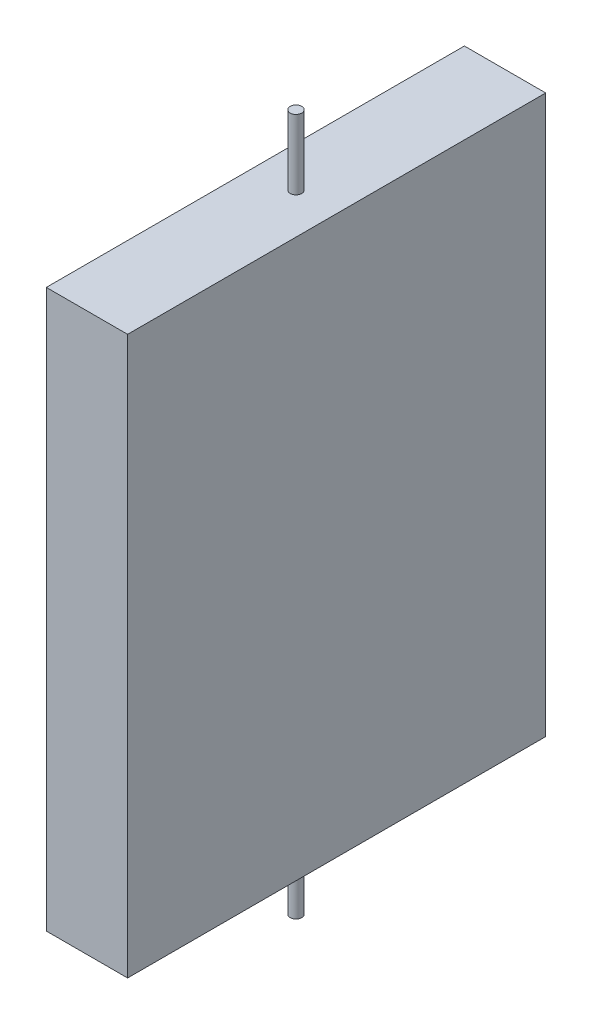
ISO-10303-21;
HEADER;
FILE_DESCRIPTION(('STEP AP214'),'2;1');
FILE_NAME('part.step','',(''),(''),'','','');
FILE_SCHEMA(('AUTOMOTIVE_DESIGN { 1 0 10303 214 1 1 1 1 }'));
ENDSEC;
DATA;
#1=APPLICATION_CONTEXT('core data for automotive mechanical design processes');
#2=APPLICATION_PROTOCOL_DEFINITION('international standard','automotive_design',2000,#1);
#3=PRODUCT_CONTEXT('',#1,'mechanical');
#4=PRODUCT('Part','Part','',(#3));
#5=PRODUCT_RELATED_PRODUCT_CATEGORY('part','',(#4));
#6=PRODUCT_DEFINITION_FORMATION('','',#4);
#7=PRODUCT_DEFINITION_CONTEXT('part definition',#1,'design');
#8=PRODUCT_DEFINITION('design','',#6,#7);
#9=PRODUCT_DEFINITION_SHAPE('','',#8);
#10=(LENGTH_UNIT() NAMED_UNIT(*) SI_UNIT(.MILLI.,.METRE.));
#11=(NAMED_UNIT(*) PLANE_ANGLE_UNIT() SI_UNIT($,.RADIAN.));
#12=(NAMED_UNIT(*) SI_UNIT($,.STERADIAN.) SOLID_ANGLE_UNIT());
#13=UNCERTAINTY_MEASURE_WITH_UNIT(LENGTH_MEASURE(1.E-05),#10,'distance_accuracy_value','');
#14=(GEOMETRIC_REPRESENTATION_CONTEXT(3) GLOBAL_UNCERTAINTY_ASSIGNED_CONTEXT((#13)) GLOBAL_UNIT_ASSIGNED_CONTEXT((#10,
#11,#12)) REPRESENTATION_CONTEXT('',''));
#15=CARTESIAN_POINT('',(0.,0.,0.));
#16=DIRECTION('',(0.,0.,1.));
#17=DIRECTION('',(1.,0.,0.));
#18=AXIS2_PLACEMENT_3D('',#15,#16,#17);
#19=CARTESIAN_POINT('',(-175.,-1200.,-900.));
#20=DIRECTION('',(0.,0.,-1.));
#21=DIRECTION('',(0.,1.,0.));
#22=AXIS2_PLACEMENT_3D('',#19,#20,#21);
#23=PLANE('',#22);
#24=DIRECTION('',(1.,0.,0.));
#25=VECTOR('',#24,1.);
#26=CARTESIAN_POINT('',(-175.,1200.,-900.));
#27=LINE('',#26,#25);
#28=CARTESIAN_POINT('',(-175.,1200.,-900.));
#29=VERTEX_POINT('',#28);
#30=CARTESIAN_POINT('',(175.,1200.,-900.));
#31=VERTEX_POINT('',#30);
#32=EDGE_CURVE('E87',#29,#31,#27,.T.);
#33=ORIENTED_EDGE('',*,*,#32,.T.);
#34=DIRECTION('',(0.,1.,0.));
#35=VECTOR('',#34,1.);
#36=CARTESIAN_POINT('',(175.,-1200.,-900.));
#37=LINE('',#36,#35);
#38=CARTESIAN_POINT('',(175.,-1200.,-900.));
#39=VERTEX_POINT('',#38);
#40=EDGE_CURVE('E89',#39,#31,#37,.T.);
#41=ORIENTED_EDGE('',*,*,#40,.F.);
#42=DIRECTION('',(1.,0.,0.));
#43=VECTOR('',#42,1.);
#44=CARTESIAN_POINT('',(-175.,-1200.,-900.));
#45=LINE('',#44,#43);
#46=CARTESIAN_POINT('',(-175.,-1200.,-900.));
#47=VERTEX_POINT('',#46);
#48=EDGE_CURVE('E54',#47,#39,#45,.T.);
#49=ORIENTED_EDGE('',*,*,#48,.F.);
#50=DIRECTION('',(0.,1.,0.));
#51=VECTOR('',#50,1.);
#52=CARTESIAN_POINT('',(-175.,-1200.,-900.));
#53=LINE('',#52,#51);
#54=EDGE_CURVE('E90',#47,#29,#53,.T.);
#55=ORIENTED_EDGE('',*,*,#54,.T.);
#56=EDGE_LOOP('',(#33,#41,#49,#55));
#57=FACE_BOUND('',#56,.T.);
#58=ADVANCED_FACE('F45',(#57),#23,.T.);
#59=CARTESIAN_POINT('',(-175.,-1200.,900.));
#60=DIRECTION('',(0.,-1.,0.));
#61=DIRECTION('',(0.,0.,-1.));
#62=AXIS2_PLACEMENT_3D('',#59,#60,#61);
#63=PLANE('',#62);
#64=CARTESIAN_POINT('',(0.,-1200.,0.));
#65=DIRECTION('',(0.,-1.,0.));
#66=DIRECTION('',(0.,0.,-1.));
#67=AXIS2_PLACEMENT_3D('',#64,#65,#66);
#68=CIRCLE('',#67,25.);
#69=CARTESIAN_POINT('',(0.,-1200.,-25.));
#70=VERTEX_POINT('',#69);
#71=EDGE_CURVE('E11',#70,#70,#68,.T.);
#72=ORIENTED_EDGE('',*,*,#71,.F.);
#73=EDGE_LOOP('',(#72));
#74=FACE_BOUND('',#73,.T.);
#75=ORIENTED_EDGE('',*,*,#48,.T.);
#76=DIRECTION('',(0.,0.,-1.));
#77=VECTOR('',#76,1.);
#78=CARTESIAN_POINT('',(175.,-1200.,900.));
#79=LINE('',#78,#77);
#80=CARTESIAN_POINT('',(175.,-1200.,900.));
#81=VERTEX_POINT('',#80);
#82=EDGE_CURVE('E104',#81,#39,#79,.T.);
#83=ORIENTED_EDGE('',*,*,#82,.F.);
#84=DIRECTION('',(1.,0.,0.));
#85=VECTOR('',#84,1.);
#86=CARTESIAN_POINT('',(-175.,-1200.,900.));
#87=LINE('',#86,#85);
#88=CARTESIAN_POINT('',(-175.,-1200.,900.));
#89=VERTEX_POINT('',#88);
#90=EDGE_CURVE('E69',#89,#81,#87,.T.);
#91=ORIENTED_EDGE('',*,*,#90,.F.);
#92=DIRECTION('',(0.,0.,-1.));
#93=VECTOR('',#92,1.);
#94=CARTESIAN_POINT('',(-175.,-1200.,900.));
#95=LINE('',#94,#93);
#96=EDGE_CURVE('E96',#89,#47,#95,.T.);
#97=ORIENTED_EDGE('',*,*,#96,.T.);
#98=EDGE_LOOP('',(#75,#83,#91,#97));
#99=FACE_BOUND('',#98,.T.);
#100=ADVANCED_FACE('F135',(#74,#99),#63,.T.);
#101=CARTESIAN_POINT('',(-175.,-1200.,900.));
#102=DIRECTION('',(0.,0.,-1.));
#103=DIRECTION('',(-1.,0.,0.));
#104=AXIS2_PLACEMENT_3D('',#101,#102,#103);
#105=PLANE('',#104);
#106=ORIENTED_EDGE('',*,*,#90,.T.);
#107=DIRECTION('',(0.,1.,0.));
#108=VECTOR('',#107,1.);
#109=CARTESIAN_POINT('',(175.,-1200.,900.));
#110=LINE('',#109,#108);
#111=CARTESIAN_POINT('',(175.,1200.,900.));
#112=VERTEX_POINT('',#111);
#113=EDGE_CURVE('E110',#81,#112,#110,.T.);
#114=ORIENTED_EDGE('',*,*,#113,.T.);
#115=DIRECTION('',(1.,0.,0.));
#116=VECTOR('',#115,1.);
#117=CARTESIAN_POINT('',(-175.,1200.,900.));
#118=LINE('',#117,#116);
#119=CARTESIAN_POINT('',(-175.,1200.,900.));
#120=VERTEX_POINT('',#119);
#121=EDGE_CURVE('E95',#120,#112,#118,.T.);
#122=ORIENTED_EDGE('',*,*,#121,.F.);
#123=DIRECTION('',(0.,1.,0.));
#124=VECTOR('',#123,1.);
#125=CARTESIAN_POINT('',(-175.,-1200.,900.));
#126=LINE('',#125,#124);
#127=EDGE_CURVE('E122',#89,#120,#126,.T.);
#128=ORIENTED_EDGE('',*,*,#127,.F.);
#129=EDGE_LOOP('',(#106,#114,#122,#128));
#130=FACE_BOUND('',#129,.T.);
#131=ADVANCED_FACE('F133',(#130),#105,.F.);
#132=CARTESIAN_POINT('',(-175.,1200.,900.));
#133=DIRECTION('',(0.,-1.,0.));
#134=DIRECTION('',(0.,0.,-1.));
#135=AXIS2_PLACEMENT_3D('',#132,#133,#134);
#136=PLANE('',#135);
#137=CARTESIAN_POINT('',(0.,1200.,0.));
#138=DIRECTION('',(0.,-1.,0.));
#139=DIRECTION('',(0.,0.,-1.));
#140=AXIS2_PLACEMENT_3D('',#137,#138,#139);
#141=CIRCLE('',#140,25.);
#142=CARTESIAN_POINT('',(0.,1200.,-25.));
#143=VERTEX_POINT('',#142);
#144=EDGE_CURVE('E48',#143,#143,#141,.T.);
#145=ORIENTED_EDGE('',*,*,#144,.T.);
#146=EDGE_LOOP('',(#145));
#147=FACE_BOUND('',#146,.T.);
#148=ORIENTED_EDGE('',*,*,#121,.T.);
#149=DIRECTION('',(0.,0.,-1.));
#150=VECTOR('',#149,1.);
#151=CARTESIAN_POINT('',(175.,1200.,900.));
#152=LINE('',#151,#150);
#153=EDGE_CURVE('E102',#112,#31,#152,.T.);
#154=ORIENTED_EDGE('',*,*,#153,.T.);
#155=ORIENTED_EDGE('',*,*,#32,.F.);
#156=DIRECTION('',(0.,0.,-1.));
#157=VECTOR('',#156,1.);
#158=CARTESIAN_POINT('',(-175.,1200.,900.));
#159=LINE('',#158,#157);
#160=EDGE_CURVE('E119',#120,#29,#159,.T.);
#161=ORIENTED_EDGE('',*,*,#160,.F.);
#162=EDGE_LOOP('',(#148,#154,#155,#161));
#163=FACE_BOUND('',#162,.T.);
#164=ADVANCED_FACE('F107',(#147,#163),#136,.F.);
#165=CARTESIAN_POINT('',(-175.,0.,0.));
#166=DIRECTION('',(-1.,0.,0.));
#167=DIRECTION('',(0.,0.,1.));
#168=AXIS2_PLACEMENT_3D('',#165,#166,#167);
#169=PLANE('',#168);
#170=ORIENTED_EDGE('',*,*,#54,.F.);
#171=ORIENTED_EDGE('',*,*,#96,.F.);
#172=ORIENTED_EDGE('',*,*,#127,.T.);
#173=ORIENTED_EDGE('',*,*,#160,.T.);
#174=EDGE_LOOP('',(#170,#171,#172,#173));
#175=FACE_BOUND('',#174,.T.);
#176=ADVANCED_FACE('F137',(#175),#169,.T.);
#177=CARTESIAN_POINT('',(175.,0.,0.));
#178=DIRECTION('',(-1.,0.,0.));
#179=DIRECTION('',(0.,0.,1.));
#180=AXIS2_PLACEMENT_3D('',#177,#178,#179);
#181=PLANE('',#180);
#182=ORIENTED_EDGE('',*,*,#40,.T.);
#183=ORIENTED_EDGE('',*,*,#153,.F.);
#184=ORIENTED_EDGE('',*,*,#113,.F.);
#185=ORIENTED_EDGE('',*,*,#82,.T.);
#186=EDGE_LOOP('',(#182,#183,#184,#185));
#187=FACE_BOUND('',#186,.T.);
#188=ADVANCED_FACE('F100',(#187),#181,.F.);
#189=CARTESIAN_POINT('',(0.,1500.,0.));
#190=DIRECTION('',(0.,1.,0.));
#191=DIRECTION('',(0.,0.,1.));
#192=AXIS2_PLACEMENT_3D('',#189,#190,#191);
#193=PLANE('',#192);
#194=CARTESIAN_POINT('',(0.,1500.,0.));
#195=DIRECTION('',(0.,1.,0.));
#196=DIRECTION('',(0.,0.,1.));
#197=AXIS2_PLACEMENT_3D('',#194,#195,#196);
#198=CIRCLE('',#197,25.);
#199=CARTESIAN_POINT('',(0.,1500.,25.));
#200=VERTEX_POINT('',#199);
#201=EDGE_CURVE('E170',#200,#200,#198,.T.);
#202=ORIENTED_EDGE('',*,*,#201,.T.);
#203=EDGE_LOOP('',(#202));
#204=FACE_BOUND('',#203,.T.);
#205=ADVANCED_FACE('F144',(#204),#193,.T.);
#206=CARTESIAN_POINT('',(0.,-1500.,0.));
#207=DIRECTION('',(0.,1.,0.));
#208=DIRECTION('',(0.,0.,1.));
#209=AXIS2_PLACEMENT_3D('',#206,#207,#208);
#210=CYLINDRICAL_SURFACE('',#209,25.);
#211=ORIENTED_EDGE('',*,*,#201,.F.);
#212=EDGE_LOOP('',(#211));
#213=FACE_BOUND('',#212,.T.);
#214=ORIENTED_EDGE('',*,*,#144,.F.);
#215=EDGE_LOOP('',(#214));
#216=FACE_BOUND('',#215,.T.);
#217=ADVANCED_FACE('F163',(#213,#216),#210,.T.);
#218=ORIENTED_EDGE('',*,*,#71,.T.);
#219=EDGE_LOOP('',(#218));
#220=FACE_BOUND('',#219,.T.);
#221=CARTESIAN_POINT('',(0.,-1500.,0.));
#222=DIRECTION('',(0.,1.,0.));
#223=DIRECTION('',(0.,0.,1.));
#224=AXIS2_PLACEMENT_3D('',#221,#222,#223);
#225=CIRCLE('',#224,25.);
#226=CARTESIAN_POINT('',(0.,-1500.,25.));
#227=VERTEX_POINT('',#226);
#228=EDGE_CURVE('E167',#227,#227,#225,.T.);
#229=ORIENTED_EDGE('',*,*,#228,.T.);
#230=EDGE_LOOP('',(#229));
#231=FACE_BOUND('',#230,.T.);
#232=ADVANCED_FACE('F159',(#220,#231),#210,.T.);
#233=CARTESIAN_POINT('',(0.,-1500.,0.));
#234=DIRECTION('',(0.,1.,0.));
#235=DIRECTION('',(0.,0.,1.));
#236=AXIS2_PLACEMENT_3D('',#233,#234,#235);
#237=PLANE('',#236);
#238=ORIENTED_EDGE('',*,*,#228,.F.);
#239=EDGE_LOOP('',(#238));
#240=FACE_BOUND('',#239,.T.);
#241=ADVANCED_FACE('F162',(#240),#237,.F.);
#242=CLOSED_SHELL('',(#58,#100,#131,#164,#176,#188,#205,#217,#232,#241));
#243=MANIFOLD_SOLID_BREP('B2',#242);
#244=ADVANCED_BREP_SHAPE_REPRESENTATION('',(#18,#243),#14);
#245=SHAPE_DEFINITION_REPRESENTATION(#9,#244);
ENDSEC;
END-ISO-10303-21;
